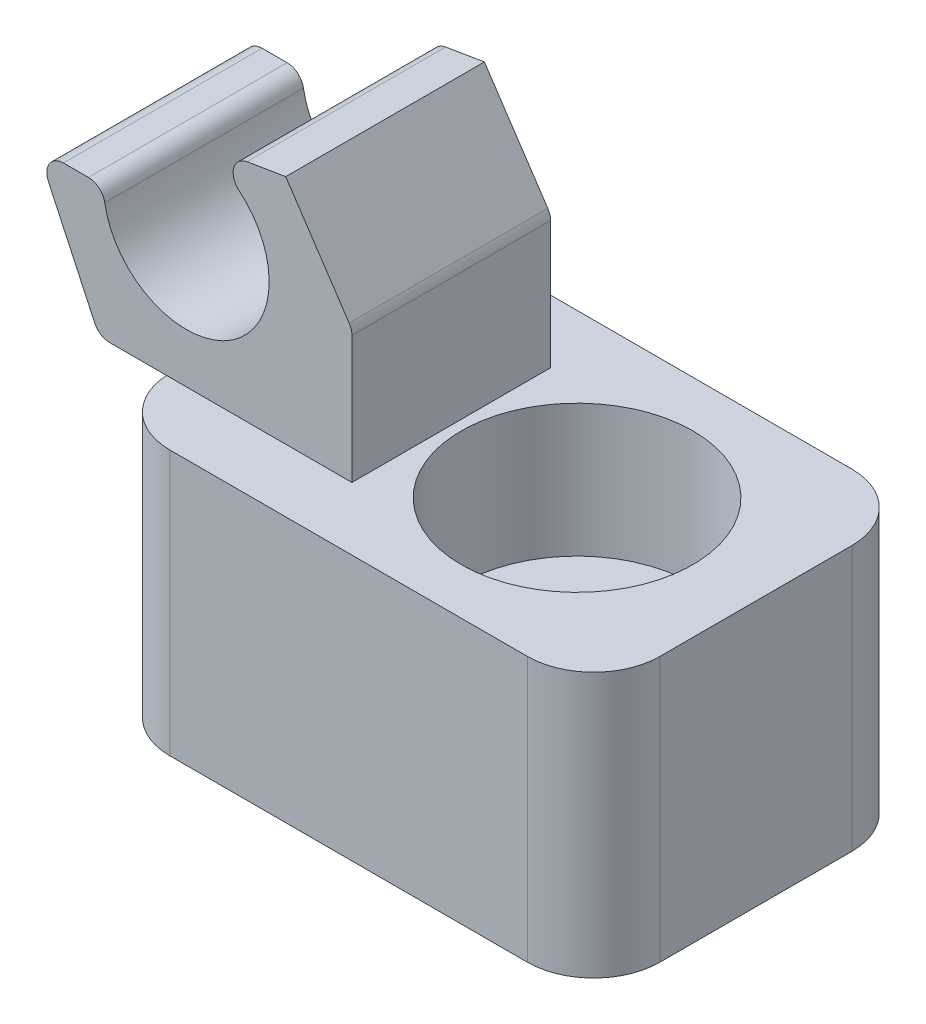
ISO-10303-21;
HEADER;
FILE_DESCRIPTION(('STEP AP214'),'2;1');
FILE_NAME('part.step','',(''),(''),'','','');
FILE_SCHEMA(('AUTOMOTIVE_DESIGN { 1 0 10303 214 1 1 1 1 }'));
ENDSEC;
DATA;
#1=APPLICATION_CONTEXT('core data for automotive mechanical design processes');
#2=APPLICATION_PROTOCOL_DEFINITION('international standard','automotive_design',2000,#1);
#3=PRODUCT_CONTEXT('',#1,'mechanical');
#4=PRODUCT('Part','Part','',(#3));
#5=PRODUCT_RELATED_PRODUCT_CATEGORY('part','',(#4));
#6=PRODUCT_DEFINITION_FORMATION('','',#4);
#7=PRODUCT_DEFINITION_CONTEXT('part definition',#1,'design');
#8=PRODUCT_DEFINITION('design','',#6,#7);
#9=PRODUCT_DEFINITION_SHAPE('','',#8);
#10=(LENGTH_UNIT() NAMED_UNIT(*) SI_UNIT(.MILLI.,.METRE.));
#11=(NAMED_UNIT(*) PLANE_ANGLE_UNIT() SI_UNIT($,.RADIAN.));
#12=(NAMED_UNIT(*) SI_UNIT($,.STERADIAN.) SOLID_ANGLE_UNIT());
#13=UNCERTAINTY_MEASURE_WITH_UNIT(LENGTH_MEASURE(1.E-05),#10,'distance_accuracy_value','');
#14=(GEOMETRIC_REPRESENTATION_CONTEXT(3) GLOBAL_UNCERTAINTY_ASSIGNED_CONTEXT((#13)) GLOBAL_UNIT_ASSIGNED_CONTEXT((#10,
#11,#12)) REPRESENTATION_CONTEXT('',''));
#15=CARTESIAN_POINT('',(0.,0.,0.));
#16=DIRECTION('',(0.,0.,1.));
#17=DIRECTION('',(1.,0.,0.));
#18=AXIS2_PLACEMENT_3D('',#15,#16,#17);
#19=CARTESIAN_POINT('',(5.4,8.,-2.9));
#20=DIRECTION('',(0.,-1.,0.));
#21=DIRECTION('',(0.,0.,-1.));
#22=AXIS2_PLACEMENT_3D('',#19,#20,#21);
#23=CYLINDRICAL_SURFACE('',#22,2.);
#24=CARTESIAN_POINT('',(5.4,0.,-2.9));
#25=DIRECTION('',(0.,1.,0.));
#26=DIRECTION('',(0.,0.,-1.));
#27=AXIS2_PLACEMENT_3D('',#24,#25,#26);
#28=CIRCLE('',#27,2.);
#29=CARTESIAN_POINT('',(7.4,0.,-2.89999999999999));
#30=VERTEX_POINT('',#29);
#31=CARTESIAN_POINT('',(5.39999999999999,0.,-4.9));
#32=VERTEX_POINT('',#31);
#33=EDGE_CURVE('E235',#30,#32,#28,.T.);
#34=ORIENTED_EDGE('',*,*,#33,.T.);
#35=DIRECTION('',(0.,-1.,0.));
#36=VECTOR('',#35,1.);
#37=CARTESIAN_POINT('',(5.39999999999999,8.,-4.9));
#38=LINE('',#37,#36);
#39=CARTESIAN_POINT('',(5.39999999999999,8.,-4.9));
#40=VERTEX_POINT('',#39);
#41=EDGE_CURVE('E296',#40,#32,#38,.T.);
#42=ORIENTED_EDGE('',*,*,#41,.F.);
#43=CARTESIAN_POINT('',(5.4,8.,-2.9));
#44=DIRECTION('',(0.,1.,0.));
#45=DIRECTION('',(0.,0.,-1.));
#46=AXIS2_PLACEMENT_3D('',#43,#44,#45);
#47=CIRCLE('',#46,2.);
#48=CARTESIAN_POINT('',(7.4,8.,-2.89999999999999));
#49=VERTEX_POINT('',#48);
#50=EDGE_CURVE('E238',#49,#40,#47,.T.);
#51=ORIENTED_EDGE('',*,*,#50,.F.);
#52=DIRECTION('',(0.,-1.,0.));
#53=VECTOR('',#52,1.);
#54=CARTESIAN_POINT('',(7.4,8.,-2.89999999999999));
#55=LINE('',#54,#53);
#56=EDGE_CURVE('E260',#49,#30,#55,.T.);
#57=ORIENTED_EDGE('',*,*,#56,.T.);
#58=EDGE_LOOP('',(#34,#42,#51,#57));
#59=FACE_BOUND('',#58,.T.);
#60=ADVANCED_FACE('F35',(#59),#23,.T.);
#61=CARTESIAN_POINT('',(-5.39999999999998,8.,-4.9));
#62=DIRECTION('',(0.,0.,1.));
#63=DIRECTION('',(1.,0.,0.));
#64=AXIS2_PLACEMENT_3D('',#61,#62,#63);
#65=PLANE('',#64);
#66=DIRECTION('',(-1.,0.,0.));
#67=VECTOR('',#66,1.);
#68=CARTESIAN_POINT('',(-5.39999999999998,0.,-4.9));
#69=LINE('',#68,#67);
#70=CARTESIAN_POINT('',(-5.39999999999998,0.,-4.9));
#71=VERTEX_POINT('',#70);
#72=EDGE_CURVE('E263',#32,#71,#69,.T.);
#73=ORIENTED_EDGE('',*,*,#72,.T.);
#74=DIRECTION('',(0.,-1.,0.));
#75=VECTOR('',#74,1.);
#76=CARTESIAN_POINT('',(-5.39999999999998,8.,-4.9));
#77=LINE('',#76,#75);
#78=CARTESIAN_POINT('',(-5.39999999999998,8.,-4.9));
#79=VERTEX_POINT('',#78);
#80=EDGE_CURVE('E293',#79,#71,#77,.T.);
#81=ORIENTED_EDGE('',*,*,#80,.F.);
#82=DIRECTION('',(-1.,0.,0.));
#83=VECTOR('',#82,1.);
#84=CARTESIAN_POINT('',(-5.39999999999998,8.,-4.9));
#85=LINE('',#84,#83);
#86=EDGE_CURVE('E241',#40,#79,#85,.T.);
#87=ORIENTED_EDGE('',*,*,#86,.F.);
#88=ORIENTED_EDGE('',*,*,#41,.T.);
#89=EDGE_LOOP('',(#73,#81,#87,#88));
#90=FACE_BOUND('',#89,.T.);
#91=ADVANCED_FACE('F379',(#90),#65,.F.);
#92=CARTESIAN_POINT('',(-5.4,8.,-2.9));
#93=DIRECTION('',(0.,-1.,0.));
#94=DIRECTION('',(0.,0.,-1.));
#95=AXIS2_PLACEMENT_3D('',#92,#93,#94);
#96=CYLINDRICAL_SURFACE('',#95,2.);
#97=CARTESIAN_POINT('',(-5.4,0.,-2.9));
#98=DIRECTION('',(0.,1.,0.));
#99=DIRECTION('',(0.,0.,-1.));
#100=AXIS2_PLACEMENT_3D('',#97,#98,#99);
#101=CIRCLE('',#100,2.);
#102=CARTESIAN_POINT('',(-7.4,0.,-2.89999999999999));
#103=VERTEX_POINT('',#102);
#104=EDGE_CURVE('E265',#71,#103,#101,.T.);
#105=ORIENTED_EDGE('',*,*,#104,.T.);
#106=DIRECTION('',(0.,-1.,0.));
#107=VECTOR('',#106,1.);
#108=CARTESIAN_POINT('',(-7.4,8.,-2.89999999999999));
#109=LINE('',#108,#107);
#110=CARTESIAN_POINT('',(-7.4,8.,-2.89999999999999));
#111=VERTEX_POINT('',#110);
#112=EDGE_CURVE('E290',#111,#103,#109,.T.);
#113=ORIENTED_EDGE('',*,*,#112,.F.);
#114=CARTESIAN_POINT('',(-5.4,8.,-2.9));
#115=DIRECTION('',(0.,1.,0.));
#116=DIRECTION('',(0.,0.,-1.));
#117=AXIS2_PLACEMENT_3D('',#114,#115,#116);
#118=CIRCLE('',#117,2.);
#119=CARTESIAN_POINT('',(-7.39749843554382,8.,-3.));
#120=VERTEX_POINT('',#119);
#121=EDGE_CURVE('E244',#120,#111,#118,.T.);
#122=ORIENTED_EDGE('',*,*,#121,.F.);
#123=EDGE_CURVE('E245',#79,#120,#118,.T.);
#124=ORIENTED_EDGE('',*,*,#123,.F.);
#125=ORIENTED_EDGE('',*,*,#80,.T.);
#126=EDGE_LOOP('',(#105,#113,#122,#124,#125));
#127=FACE_BOUND('',#126,.T.);
#128=ADVANCED_FACE('F385',(#127),#96,.T.);
#129=CARTESIAN_POINT('',(-7.4,8.,2.89999999999999));
#130=DIRECTION('',(1.,0.,0.));
#131=DIRECTION('',(0.,0.,-1.));
#132=AXIS2_PLACEMENT_3D('',#129,#130,#131);
#133=PLANE('',#132);
#134=DIRECTION('',(0.,0.,1.));
#135=VECTOR('',#134,1.);
#136=CARTESIAN_POINT('',(-7.4,0.,2.89999999999999));
#137=LINE('',#136,#135);
#138=CARTESIAN_POINT('',(-7.4,0.,2.89999999999999));
#139=VERTEX_POINT('',#138);
#140=EDGE_CURVE('E267',#103,#139,#137,.T.);
#141=ORIENTED_EDGE('',*,*,#140,.T.);
#142=DIRECTION('',(0.,-1.,0.));
#143=VECTOR('',#142,1.);
#144=CARTESIAN_POINT('',(-7.4,8.,2.89999999999999));
#145=LINE('',#144,#143);
#146=CARTESIAN_POINT('',(-7.4,8.,2.89999999999999));
#147=VERTEX_POINT('',#146);
#148=EDGE_CURVE('E287',#147,#139,#145,.T.);
#149=ORIENTED_EDGE('',*,*,#148,.F.);
#150=DIRECTION('',(0.,0.,1.));
#151=VECTOR('',#150,1.);
#152=CARTESIAN_POINT('',(-7.4,8.,2.89999999999999));
#153=LINE('',#152,#151);
#154=EDGE_CURVE('E247',#111,#147,#153,.T.);
#155=ORIENTED_EDGE('',*,*,#154,.F.);
#156=ORIENTED_EDGE('',*,*,#112,.T.);
#157=EDGE_LOOP('',(#141,#149,#155,#156));
#158=FACE_BOUND('',#157,.T.);
#159=ADVANCED_FACE('F429',(#158),#133,.F.);
#160=CARTESIAN_POINT('',(-5.4,8.,2.9));
#161=DIRECTION('',(0.,-1.,0.));
#162=DIRECTION('',(0.,0.,-1.));
#163=AXIS2_PLACEMENT_3D('',#160,#161,#162);
#164=CYLINDRICAL_SURFACE('',#163,2.);
#165=CARTESIAN_POINT('',(-5.4,0.,2.9));
#166=DIRECTION('',(0.,1.,0.));
#167=DIRECTION('',(0.,0.,-1.));
#168=AXIS2_PLACEMENT_3D('',#165,#166,#167);
#169=CIRCLE('',#168,2.);
#170=CARTESIAN_POINT('',(-5.39999999999998,0.,4.9));
#171=VERTEX_POINT('',#170);
#172=EDGE_CURVE('E269',#139,#171,#169,.T.);
#173=ORIENTED_EDGE('',*,*,#172,.T.);
#174=DIRECTION('',(0.,-1.,0.));
#175=VECTOR('',#174,1.);
#176=CARTESIAN_POINT('',(-5.39999999999998,8.,4.9));
#177=LINE('',#176,#175);
#178=CARTESIAN_POINT('',(-5.39999999999998,8.,4.9));
#179=VERTEX_POINT('',#178);
#180=EDGE_CURVE('E284',#179,#171,#177,.T.);
#181=ORIENTED_EDGE('',*,*,#180,.F.);
#182=CARTESIAN_POINT('',(-5.4,8.,2.9));
#183=DIRECTION('',(0.,1.,0.));
#184=DIRECTION('',(0.,0.,-1.));
#185=AXIS2_PLACEMENT_3D('',#182,#183,#184);
#186=CIRCLE('',#185,2.);
#187=CARTESIAN_POINT('',(-7.39749843554382,8.,3.));
#188=VERTEX_POINT('',#187);
#189=EDGE_CURVE('E250',#188,#179,#186,.T.);
#190=ORIENTED_EDGE('',*,*,#189,.F.);
#191=EDGE_CURVE('E251',#147,#188,#186,.T.);
#192=ORIENTED_EDGE('',*,*,#191,.F.);
#193=ORIENTED_EDGE('',*,*,#148,.T.);
#194=EDGE_LOOP('',(#173,#181,#190,#192,#193));
#195=FACE_BOUND('',#194,.T.);
#196=ADVANCED_FACE('F416',(#195),#164,.T.);
#197=CARTESIAN_POINT('',(-5.39999999999998,8.,4.9));
#198=DIRECTION('',(0.,0.,-1.));
#199=DIRECTION('',(-1.,0.,0.));
#200=AXIS2_PLACEMENT_3D('',#197,#198,#199);
#201=PLANE('',#200);
#202=DIRECTION('',(1.,0.,0.));
#203=VECTOR('',#202,1.);
#204=CARTESIAN_POINT('',(-5.39999999999998,0.,4.9));
#205=LINE('',#204,#203);
#206=CARTESIAN_POINT('',(5.39999999999999,0.,4.9));
#207=VERTEX_POINT('',#206);
#208=EDGE_CURVE('E271',#171,#207,#205,.T.);
#209=ORIENTED_EDGE('',*,*,#208,.T.);
#210=DIRECTION('',(0.,-1.,0.));
#211=VECTOR('',#210,1.);
#212=CARTESIAN_POINT('',(5.39999999999999,8.,4.9));
#213=LINE('',#212,#211);
#214=CARTESIAN_POINT('',(5.39999999999999,8.,4.9));
#215=VERTEX_POINT('',#214);
#216=EDGE_CURVE('E281',#215,#207,#213,.T.);
#217=ORIENTED_EDGE('',*,*,#216,.F.);
#218=DIRECTION('',(1.,0.,0.));
#219=VECTOR('',#218,1.);
#220=CARTESIAN_POINT('',(-5.39999999999998,8.,4.9));
#221=LINE('',#220,#219);
#222=EDGE_CURVE('E254',#179,#215,#221,.T.);
#223=ORIENTED_EDGE('',*,*,#222,.F.);
#224=ORIENTED_EDGE('',*,*,#180,.T.);
#225=EDGE_LOOP('',(#209,#217,#223,#224));
#226=FACE_BOUND('',#225,.T.);
#227=ADVANCED_FACE('F436',(#226),#201,.F.);
#228=CARTESIAN_POINT('',(5.4,8.,2.9));
#229=DIRECTION('',(0.,-1.,0.));
#230=DIRECTION('',(0.,0.,-1.));
#231=AXIS2_PLACEMENT_3D('',#228,#229,#230);
#232=CYLINDRICAL_SURFACE('',#231,2.);
#233=CARTESIAN_POINT('',(5.4,0.,2.9));
#234=DIRECTION('',(0.,1.,0.));
#235=DIRECTION('',(0.,0.,1.));
#236=AXIS2_PLACEMENT_3D('',#233,#234,#235);
#237=CIRCLE('',#236,2.);
#238=CARTESIAN_POINT('',(7.4,0.,2.89999999999999));
#239=VERTEX_POINT('',#238);
#240=EDGE_CURVE('E273',#207,#239,#237,.T.);
#241=ORIENTED_EDGE('',*,*,#240,.T.);
#242=DIRECTION('',(0.,-1.,0.));
#243=VECTOR('',#242,1.);
#244=CARTESIAN_POINT('',(7.4,8.,2.89999999999999));
#245=LINE('',#244,#243);
#246=CARTESIAN_POINT('',(7.4,8.,2.89999999999999));
#247=VERTEX_POINT('',#246);
#248=EDGE_CURVE('E278',#247,#239,#245,.T.);
#249=ORIENTED_EDGE('',*,*,#248,.F.);
#250=CARTESIAN_POINT('',(5.4,8.,2.9));
#251=DIRECTION('',(0.,1.,0.));
#252=DIRECTION('',(0.,0.,1.));
#253=AXIS2_PLACEMENT_3D('',#250,#251,#252);
#254=CIRCLE('',#253,2.);
#255=EDGE_CURVE('E256',#215,#247,#254,.T.);
#256=ORIENTED_EDGE('',*,*,#255,.F.);
#257=ORIENTED_EDGE('',*,*,#216,.T.);
#258=EDGE_LOOP('',(#241,#249,#256,#257));
#259=FACE_BOUND('',#258,.T.);
#260=ADVANCED_FACE('F440',(#259),#232,.T.);
#261=CARTESIAN_POINT('',(7.4,8.,2.89999999999999));
#262=DIRECTION('',(-1.,0.,0.));
#263=DIRECTION('',(0.,0.,1.));
#264=AXIS2_PLACEMENT_3D('',#261,#262,#263);
#265=PLANE('',#264);
#266=DIRECTION('',(0.,0.,-1.));
#267=VECTOR('',#266,1.);
#268=CARTESIAN_POINT('',(7.4,0.,2.89999999999999));
#269=LINE('',#268,#267);
#270=EDGE_CURVE('E242',#239,#30,#269,.T.);
#271=ORIENTED_EDGE('',*,*,#270,.T.);
#272=ORIENTED_EDGE('',*,*,#56,.F.);
#273=DIRECTION('',(0.,0.,-1.));
#274=VECTOR('',#273,1.);
#275=CARTESIAN_POINT('',(7.4,8.,2.89999999999999));
#276=LINE('',#275,#274);
#277=EDGE_CURVE('E258',#247,#49,#276,.T.);
#278=ORIENTED_EDGE('',*,*,#277,.F.);
#279=ORIENTED_EDGE('',*,*,#248,.T.);
#280=EDGE_LOOP('',(#271,#272,#278,#279));
#281=FACE_BOUND('',#280,.T.);
#282=ADVANCED_FACE('F446',(#281),#265,.F.);
#283=CARTESIAN_POINT('',(5.4,8.,-2.9));
#284=DIRECTION('',(0.,-1.,0.));
#285=DIRECTION('',(0.,0.,-1.));
#286=AXIS2_PLACEMENT_3D('',#283,#284,#285);
#287=PLANE('',#286);
#288=CARTESIAN_POINT('',(2.,8.,0.));
#289=DIRECTION('',(0.,1.,0.));
#290=DIRECTION('',(0.,0.,1.));
#291=AXIS2_PLACEMENT_3D('',#288,#289,#290);
#292=CIRCLE('',#291,3.5);
#293=CARTESIAN_POINT('',(2.,8.,3.5));
#294=VERTEX_POINT('',#293);
#295=EDGE_CURVE('E229',#294,#294,#292,.T.);
#296=ORIENTED_EDGE('',*,*,#295,.F.);
#297=EDGE_LOOP('',(#296));
#298=FACE_BOUND('',#297,.T.);
#299=DIRECTION('',(0.,0.,1.));
#300=VECTOR('',#299,1.);
#301=CARTESIAN_POINT('',(-1.8,8.,-3.));
#302=LINE('',#301,#300);
#303=CARTESIAN_POINT('',(-1.8,8.,-3.));
#304=VERTEX_POINT('',#303);
#305=CARTESIAN_POINT('',(-1.8,8.,3.));
#306=VERTEX_POINT('',#305);
#307=EDGE_CURVE('E201',#304,#306,#302,.T.);
#308=ORIENTED_EDGE('',*,*,#307,.T.);
#309=DIRECTION('',(-1.,0.,0.));
#310=VECTOR('',#309,1.);
#311=CARTESIAN_POINT('',(0.,8.,3.));
#312=LINE('',#311,#310);
#313=EDGE_CURVE('E354',#306,#188,#312,.T.);
#314=ORIENTED_EDGE('',*,*,#313,.T.);
#315=ORIENTED_EDGE('',*,*,#189,.T.);
#316=ORIENTED_EDGE('',*,*,#222,.T.);
#317=ORIENTED_EDGE('',*,*,#255,.T.);
#318=ORIENTED_EDGE('',*,*,#277,.T.);
#319=ORIENTED_EDGE('',*,*,#50,.T.);
#320=ORIENTED_EDGE('',*,*,#86,.T.);
#321=ORIENTED_EDGE('',*,*,#123,.T.);
#322=DIRECTION('',(-1.,0.,0.));
#323=VECTOR('',#322,1.);
#324=CARTESIAN_POINT('',(0.,8.,-3.));
#325=LINE('',#324,#323);
#326=EDGE_CURVE('E216',#304,#120,#325,.T.);
#327=ORIENTED_EDGE('',*,*,#326,.F.);
#328=EDGE_LOOP('',(#308,#314,#315,#316,#317,#318,#319,#320,#321,#327));
#329=FACE_BOUND('',#328,.T.);
#330=ADVANCED_FACE('F421',(#298,#329),#287,.F.);
#331=CARTESIAN_POINT('',(5.4,0.,-2.9));
#332=DIRECTION('',(0.,-1.,0.));
#333=DIRECTION('',(0.,0.,-1.));
#334=AXIS2_PLACEMENT_3D('',#331,#332,#333);
#335=PLANE('',#334);
#336=CARTESIAN_POINT('',(2.,0.,0.));
#337=DIRECTION('',(0.,1.,0.));
#338=DIRECTION('',(0.,0.,1.));
#339=AXIS2_PLACEMENT_3D('',#336,#337,#338);
#340=CIRCLE('',#339,1.8);
#341=CARTESIAN_POINT('',(2.,0.,1.8));
#342=VERTEX_POINT('',#341);
#343=EDGE_CURVE('E226',#342,#342,#340,.T.);
#344=ORIENTED_EDGE('',*,*,#343,.T.);
#345=EDGE_LOOP('',(#344));
#346=FACE_BOUND('',#345,.T.);
#347=ORIENTED_EDGE('',*,*,#33,.F.);
#348=ORIENTED_EDGE('',*,*,#270,.F.);
#349=ORIENTED_EDGE('',*,*,#240,.F.);
#350=ORIENTED_EDGE('',*,*,#208,.F.);
#351=ORIENTED_EDGE('',*,*,#172,.F.);
#352=ORIENTED_EDGE('',*,*,#140,.F.);
#353=ORIENTED_EDGE('',*,*,#104,.F.);
#354=ORIENTED_EDGE('',*,*,#72,.F.);
#355=EDGE_LOOP('',(#347,#348,#349,#350,#351,#352,#353,#354));
#356=FACE_BOUND('',#355,.T.);
#357=ADVANCED_FACE('F432',(#346,#356),#335,.T.);
#358=CARTESIAN_POINT('',(2.,4.,0.));
#359=DIRECTION('',(0.,1.,0.));
#360=DIRECTION('',(0.,0.,1.));
#361=AXIS2_PLACEMENT_3D('',#358,#359,#360);
#362=CYLINDRICAL_SURFACE('',#361,3.5);
#363=CARTESIAN_POINT('',(2.,4.,0.));
#364=DIRECTION('',(0.,1.,0.));
#365=DIRECTION('',(0.,0.,1.));
#366=AXIS2_PLACEMENT_3D('',#363,#364,#365);
#367=CIRCLE('',#366,3.5);
#368=CARTESIAN_POINT('',(2.,4.,3.5));
#369=VERTEX_POINT('',#368);
#370=EDGE_CURVE('E232',#369,#369,#367,.T.);
#371=ORIENTED_EDGE('',*,*,#370,.F.);
#372=EDGE_LOOP('',(#371));
#373=FACE_BOUND('',#372,.T.);
#374=ORIENTED_EDGE('',*,*,#295,.T.);
#375=EDGE_LOOP('',(#374));
#376=FACE_BOUND('',#375,.T.);
#377=ADVANCED_FACE('F594',(#373,#376),#362,.F.);
#378=CARTESIAN_POINT('',(2.,4.,0.));
#379=DIRECTION('',(0.,1.,0.));
#380=DIRECTION('',(0.,0.,1.));
#381=AXIS2_PLACEMENT_3D('',#378,#379,#380);
#382=PLANE('',#381);
#383=CARTESIAN_POINT('',(2.,4.,0.));
#384=DIRECTION('',(0.,1.,0.));
#385=DIRECTION('',(0.,0.,1.));
#386=AXIS2_PLACEMENT_3D('',#383,#384,#385);
#387=CIRCLE('',#386,1.8);
#388=CARTESIAN_POINT('',(2.,4.,1.8));
#389=VERTEX_POINT('',#388);
#390=EDGE_CURVE('E200',#389,#389,#387,.T.);
#391=ORIENTED_EDGE('',*,*,#390,.F.);
#392=EDGE_LOOP('',(#391));
#393=FACE_BOUND('',#392,.T.);
#394=ORIENTED_EDGE('',*,*,#370,.T.);
#395=EDGE_LOOP('',(#394));
#396=FACE_BOUND('',#395,.T.);
#397=ADVANCED_FACE('F590',(#393,#396),#382,.T.);
#398=CARTESIAN_POINT('',(2.,0.,0.));
#399=DIRECTION('',(0.,1.,0.));
#400=DIRECTION('',(0.,0.,1.));
#401=AXIS2_PLACEMENT_3D('',#398,#399,#400);
#402=CYLINDRICAL_SURFACE('',#401,1.8);
#403=ORIENTED_EDGE('',*,*,#343,.F.);
#404=EDGE_LOOP('',(#403));
#405=FACE_BOUND('',#404,.T.);
#406=ORIENTED_EDGE('',*,*,#390,.T.);
#407=EDGE_LOOP('',(#406));
#408=FACE_BOUND('',#407,.T.);
#409=ADVANCED_FACE('F473',(#405,#408),#402,.F.);
#410=CARTESIAN_POINT('',(0.,8.,-3.));
#411=DIRECTION('',(0.,1.,0.));
#412=DIRECTION('',(0.,0.,1.));
#413=AXIS2_PLACEMENT_3D('',#410,#411,#412);
#414=PLANE('',#413);
#415=CARTESIAN_POINT('',(-9.11623423697627,8.,3.));
#416=VERTEX_POINT('',#415);
#417=EDGE_CURVE('E353',#188,#416,#312,.T.);
#418=ORIENTED_EDGE('',*,*,#417,.T.);
#419=DIRECTION('',(0.,0.,1.));
#420=VECTOR('',#419,1.);
#421=CARTESIAN_POINT('',(-9.11623423697627,8.,-3.));
#422=LINE('',#421,#420);
#423=CARTESIAN_POINT('',(-9.11623423697627,8.,-3.));
#424=VERTEX_POINT('',#423);
#425=EDGE_CURVE('E313',#416,#424,#422,.F.);
#426=ORIENTED_EDGE('',*,*,#425,.T.);
#427=EDGE_CURVE('E215',#120,#424,#325,.T.);
#428=ORIENTED_EDGE('',*,*,#427,.F.);
#429=ORIENTED_EDGE('',*,*,#121,.T.);
#430=ORIENTED_EDGE('',*,*,#154,.T.);
#431=ORIENTED_EDGE('',*,*,#191,.T.);
#432=EDGE_LOOP('',(#418,#426,#428,#429,#430,#431));
#433=FACE_BOUND('',#432,.T.);
#434=ADVANCED_FACE('F409',(#433),#414,.F.);
#435=CARTESIAN_POINT('',(-6.8,12.,-3.));
#436=DIRECTION('',(0.,0.,1.));
#437=DIRECTION('',(1.,0.,0.));
#438=AXIS2_PLACEMENT_3D('',#435,#436,#437);
#439=CYLINDRICAL_SURFACE('',#438,2.5);
#440=CARTESIAN_POINT('',(-6.8,12.,-3.));
#441=DIRECTION('',(0.,0.,1.));
#442=DIRECTION('',(1.,0.,0.));
#443=AXIS2_PLACEMENT_3D('',#440,#441,#442);
#444=CIRCLE('',#443,2.5);
#445=CARTESIAN_POINT('',(-9.26503324295817,11.5833333333333,-3.));
#446=VERTEX_POINT('',#445);
#447=CARTESIAN_POINT('',(-5.20667093944838,13.9264741121546,-3.));
#448=VERTEX_POINT('',#447);
#449=EDGE_CURVE('E205',#446,#448,#444,.T.);
#450=ORIENTED_EDGE('',*,*,#449,.F.);
#451=DIRECTION('',(0.,0.,1.));
#452=VECTOR('',#451,1.);
#453=CARTESIAN_POINT('',(-9.26503324295817,11.5833333333333,-3.));
#454=LINE('',#453,#452);
#455=CARTESIAN_POINT('',(-9.26503324295817,11.5833333333333,3.));
#456=VERTEX_POINT('',#455);
#457=EDGE_CURVE('E43',#446,#456,#454,.T.);
#458=ORIENTED_EDGE('',*,*,#457,.T.);
#459=CARTESIAN_POINT('',(-6.8,12.,3.));
#460=DIRECTION('',(0.,0.,1.));
#461=DIRECTION('',(1.,0.,0.));
#462=AXIS2_PLACEMENT_3D('',#459,#460,#461);
#463=CIRCLE('',#462,2.5);
#464=CARTESIAN_POINT('',(-5.20667093944838,13.9264741121546,3.));
#465=VERTEX_POINT('',#464);
#466=EDGE_CURVE('E341',#456,#465,#463,.T.);
#467=ORIENTED_EDGE('',*,*,#466,.T.);
#468=DIRECTION('',(0.,0.,1.));
#469=VECTOR('',#468,1.);
#470=CARTESIAN_POINT('',(-5.20667093944838,13.9264741121546,-3.));
#471=LINE('',#470,#469);
#472=EDGE_CURVE('E333',#465,#448,#471,.F.);
#473=ORIENTED_EDGE('',*,*,#472,.T.);
#474=EDGE_LOOP('',(#450,#458,#467,#473));
#475=FACE_BOUND('',#474,.T.);
#476=ADVANCED_FACE('F340',(#475),#439,.F.);
#477=CARTESIAN_POINT('',(-2.53513513513513,15.2108108108108,-3.));
#478=DIRECTION('',(-0.164398987305357,0.986393923832144,0.));
#479=DIRECTION('',(-0.986393923832144,-0.164398987305357,0.));
#480=AXIS2_PLACEMENT_3D('',#477,#478,#479);
#481=PLANE('',#480);
#482=DIRECTION('',(-0.986393923832144,-0.164398987305357,0.));
#483=VECTOR('',#482,1.);
#484=CARTESIAN_POINT('',(-2.53513513513513,15.2108108108108,-3.));
#485=LINE('',#484,#483);
#486=CARTESIAN_POINT('',(-3.8,15.,-3.));
#487=VERTEX_POINT('',#486);
#488=CARTESIAN_POINT('',(-4.97020462099074,14.8049658965015,-3.));
#489=VERTEX_POINT('',#488);
#490=EDGE_CURVE('E223',#487,#489,#485,.T.);
#491=ORIENTED_EDGE('',*,*,#490,.T.);
#492=DIRECTION('',(0.,0.,-1.));
#493=VECTOR('',#492,1.);
#494=CARTESIAN_POINT('',(-4.97020462099074,14.8049658965015,3.));
#495=LINE('',#494,#493);
#496=CARTESIAN_POINT('',(-4.97020462099074,14.8049658965015,3.));
#497=VERTEX_POINT('',#496);
#498=EDGE_CURVE('E11',#489,#497,#495,.F.);
#499=ORIENTED_EDGE('',*,*,#498,.T.);
#500=DIRECTION('',(-0.986393923832144,-0.164398987305357,0.));
#501=VECTOR('',#500,1.);
#502=CARTESIAN_POINT('',(-2.53513513513513,15.2108108108108,3.));
#503=LINE('',#502,#501);
#504=CARTESIAN_POINT('',(-3.8,15.,3.));
#505=VERTEX_POINT('',#504);
#506=EDGE_CURVE('E185',#505,#497,#503,.T.);
#507=ORIENTED_EDGE('',*,*,#506,.F.);
#508=DIRECTION('',(0.,0.,1.));
#509=VECTOR('',#508,1.);
#510=CARTESIAN_POINT('',(-3.8,15.,-3.));
#511=LINE('',#510,#509);
#512=EDGE_CURVE('E193',#487,#505,#511,.T.);
#513=ORIENTED_EDGE('',*,*,#512,.F.);
#514=EDGE_LOOP('',(#491,#499,#507,#513));
#515=FACE_BOUND('',#514,.T.);
#516=ADVANCED_FACE('F203',(#515),#481,.T.);
#517=CARTESIAN_POINT('',(4.29230769230769,2.86153846153846,-3.));
#518=DIRECTION('',(0.832050294337844,0.554700196225229,0.));
#519=DIRECTION('',(-0.554700196225229,0.832050294337843,0.));
#520=AXIS2_PLACEMENT_3D('',#517,#518,#519);
#521=PLANE('',#520);
#522=DIRECTION('',(-0.554700196225229,0.832050294337844,0.));
#523=VECTOR('',#522,1.);
#524=CARTESIAN_POINT('',(4.29230769230769,2.86153846153846,3.));
#525=LINE('',#524,#523);
#526=CARTESIAN_POINT('',(-1.88397485283108,12.1259622792466,3.));
#527=VERTEX_POINT('',#526);
#528=EDGE_CURVE('E180',#527,#505,#525,.T.);
#529=ORIENTED_EDGE('',*,*,#528,.F.);
#530=DIRECTION('',(0.,0.,1.));
#531=VECTOR('',#530,1.);
#532=CARTESIAN_POINT('',(-1.88397485283108,12.1259622792466,-3.));
#533=LINE('',#532,#531);
#534=CARTESIAN_POINT('',(-1.88397485283108,12.1259622792466,-3.));
#535=VERTEX_POINT('',#534);
#536=EDGE_CURVE('E331',#527,#535,#533,.F.);
#537=ORIENTED_EDGE('',*,*,#536,.T.);
#538=DIRECTION('',(-0.554700196225229,0.832050294337844,0.));
#539=VECTOR('',#538,1.);
#540=CARTESIAN_POINT('',(4.29230769230769,2.86153846153846,-3.));
#541=LINE('',#540,#539);
#542=EDGE_CURVE('E196',#535,#487,#541,.T.);
#543=ORIENTED_EDGE('',*,*,#542,.T.);
#544=ORIENTED_EDGE('',*,*,#512,.T.);
#545=EDGE_LOOP('',(#529,#537,#543,#544));
#546=FACE_BOUND('',#545,.T.);
#547=ADVANCED_FACE('F194',(#546),#521,.T.);
#548=CARTESIAN_POINT('',(-1.8,0.,-3.));
#549=DIRECTION('',(1.,0.,0.));
#550=DIRECTION('',(0.,0.,-1.));
#551=AXIS2_PLACEMENT_3D('',#548,#549,#550);
#552=PLANE('',#551);
#553=DIRECTION('',(0.,1.,0.));
#554=VECTOR('',#553,1.);
#555=CARTESIAN_POINT('',(-1.8,0.,-3.));
#556=LINE('',#555,#554);
#557=CARTESIAN_POINT('',(-1.8,11.848612181134,-3.));
#558=VERTEX_POINT('',#557);
#559=EDGE_CURVE('E219',#304,#558,#556,.T.);
#560=ORIENTED_EDGE('',*,*,#559,.T.);
#561=DIRECTION('',(0.,0.,1.));
#562=VECTOR('',#561,1.);
#563=CARTESIAN_POINT('',(-1.8,11.848612181134,-3.));
#564=LINE('',#563,#562);
#565=CARTESIAN_POINT('',(-1.8,11.848612181134,3.));
#566=VERTEX_POINT('',#565);
#567=EDGE_CURVE('E328',#558,#566,#564,.T.);
#568=ORIENTED_EDGE('',*,*,#567,.T.);
#569=DIRECTION('',(0.,1.,0.));
#570=VECTOR('',#569,1.);
#571=CARTESIAN_POINT('',(-1.8,0.,3.));
#572=LINE('',#571,#570);
#573=EDGE_CURVE('E190',#306,#566,#572,.T.);
#574=ORIENTED_EDGE('',*,*,#573,.F.);
#575=ORIENTED_EDGE('',*,*,#307,.F.);
#576=EDGE_LOOP('',(#560,#568,#574,#575));
#577=FACE_BOUND('',#576,.T.);
#578=ADVANCED_FACE('F360',(#577),#552,.T.);
#579=CARTESIAN_POINT('',(-4.68548333601512,-2.18487676174147,-3.));
#580=DIRECTION('',(0.906307787036651,0.422618261740697,0.));
#581=DIRECTION('',(-0.422618261740697,0.906307787036651,0.));
#582=AXIS2_PLACEMENT_3D('',#579,#580,#581);
#583=PLANE('',#582);
#584=DIRECTION('',(-0.422618261740697,0.906307787036651,0.));
#585=VECTOR('',#584,1.);
#586=CARTESIAN_POINT('',(-4.68548333601512,-2.18487676174147,-3.));
#587=LINE('',#586,#585);
#588=CARTESIAN_POINT('',(-9.5693881304946,8.28869086912965,-3.));
#589=VERTEX_POINT('',#588);
#590=CARTESIAN_POINT('',(-10.9683111049596,11.2886908691297,-3.));
#591=VERTEX_POINT('',#590);
#592=EDGE_CURVE('E213',#589,#591,#587,.T.);
#593=ORIENTED_EDGE('',*,*,#592,.F.);
#594=DIRECTION('',(0.,0.,1.));
#595=VECTOR('',#594,1.);
#596=CARTESIAN_POINT('',(-9.5693881304946,8.28869086912965,-3.));
#597=LINE('',#596,#595);
#598=CARTESIAN_POINT('',(-9.5693881304946,8.28869086912965,3.));
#599=VERTEX_POINT('',#598);
#600=EDGE_CURVE('E301',#589,#599,#597,.T.);
#601=ORIENTED_EDGE('',*,*,#600,.T.);
#602=DIRECTION('',(-0.422618261740697,0.906307787036651,0.));
#603=VECTOR('',#602,1.);
#604=CARTESIAN_POINT('',(-4.68548333601512,-2.18487676174147,3.));
#605=LINE('',#604,#603);
#606=CARTESIAN_POINT('',(-10.9683111049596,11.2886908691297,3.));
#607=VERTEX_POINT('',#606);
#608=EDGE_CURVE('E348',#599,#607,#605,.T.);
#609=ORIENTED_EDGE('',*,*,#608,.T.);
#610=DIRECTION('',(0.,0.,1.));
#611=VECTOR('',#610,1.);
#612=CARTESIAN_POINT('',(-10.9683111049596,11.2886908691297,-3.));
#613=LINE('',#612,#611);
#614=EDGE_CURVE('E299',#607,#591,#613,.F.);
#615=ORIENTED_EDGE('',*,*,#614,.T.);
#616=EDGE_LOOP('',(#593,#601,#609,#615));
#617=FACE_BOUND('',#616,.T.);
#618=ADVANCED_FACE('F403',(#617),#583,.F.);
#619=CARTESIAN_POINT('',(0.,12.,-3.));
#620=DIRECTION('',(0.,-1.,0.));
#621=DIRECTION('',(0.,0.,-1.));
#622=AXIS2_PLACEMENT_3D('',#619,#620,#621);
#623=PLANE('',#622);
#624=DIRECTION('',(1.,0.,0.));
#625=VECTOR('',#624,1.);
#626=CARTESIAN_POINT('',(0.,12.,-3.));
#627=LINE('',#626,#625);
#628=CARTESIAN_POINT('',(-10.5151572114413,12.,-3.));
#629=VERTEX_POINT('',#628);
#630=CARTESIAN_POINT('',(-9.75803989154981,12.,-3.));
#631=VERTEX_POINT('',#630);
#632=EDGE_CURVE('E208',#629,#631,#627,.T.);
#633=ORIENTED_EDGE('',*,*,#632,.F.);
#634=DIRECTION('',(0.,0.,1.));
#635=VECTOR('',#634,1.);
#636=CARTESIAN_POINT('',(-10.5151572114413,12.,-3.));
#637=LINE('',#636,#635);
#638=CARTESIAN_POINT('',(-10.5151572114413,12.,3.));
#639=VERTEX_POINT('',#638);
#640=EDGE_CURVE('E325',#629,#639,#637,.T.);
#641=ORIENTED_EDGE('',*,*,#640,.T.);
#642=DIRECTION('',(1.,0.,0.));
#643=VECTOR('',#642,1.);
#644=CARTESIAN_POINT('',(0.,12.,3.));
#645=LINE('',#644,#643);
#646=CARTESIAN_POINT('',(-9.75803989154981,12.,3.));
#647=VERTEX_POINT('',#646);
#648=EDGE_CURVE('E346',#639,#647,#645,.T.);
#649=ORIENTED_EDGE('',*,*,#648,.T.);
#650=DIRECTION('',(0.,0.,1.));
#651=VECTOR('',#650,1.);
#652=CARTESIAN_POINT('',(-9.75803989154981,12.,-3.));
#653=LINE('',#652,#651);
#654=EDGE_CURVE('E50',#647,#631,#653,.F.);
#655=ORIENTED_EDGE('',*,*,#654,.T.);
#656=EDGE_LOOP('',(#633,#641,#649,#655));
#657=FACE_BOUND('',#656,.T.);
#658=ADVANCED_FACE('F400',(#657),#623,.F.);
#659=CARTESIAN_POINT('',(0.,0.,-3.));
#660=DIRECTION('',(0.,0.,1.));
#661=DIRECTION('',(1.,0.,0.));
#662=AXIS2_PLACEMENT_3D('',#659,#660,#661);
#663=PLANE('',#662);
#664=ORIENTED_EDGE('',*,*,#427,.T.);
#665=CARTESIAN_POINT('',(-9.11623423697627,8.5,-3.));
#666=DIRECTION('',(0.,0.,1.));
#667=DIRECTION('',(1.,0.,0.));
#668=AXIS2_PLACEMENT_3D('',#665,#666,#667);
#669=CIRCLE('',#668,0.5);
#670=EDGE_CURVE('E322',#424,#589,#669,.F.);
#671=ORIENTED_EDGE('',*,*,#670,.T.);
#672=ORIENTED_EDGE('',*,*,#592,.T.);
#673=CARTESIAN_POINT('',(-10.5151572114413,11.5,-3.));
#674=DIRECTION('',(0.,0.,1.));
#675=DIRECTION('',(1.,0.,0.));
#676=AXIS2_PLACEMENT_3D('',#673,#674,#675);
#677=CIRCLE('',#676,0.5);
#678=EDGE_CURVE('E57',#591,#629,#677,.F.);
#679=ORIENTED_EDGE('',*,*,#678,.T.);
#680=ORIENTED_EDGE('',*,*,#632,.T.);
#681=CARTESIAN_POINT('',(-9.75803989154981,11.5,-3.));
#682=DIRECTION('',(0.,0.,1.));
#683=DIRECTION('',(1.,0.,0.));
#684=AXIS2_PLACEMENT_3D('',#681,#682,#683);
#685=CIRCLE('',#684,0.5);
#686=EDGE_CURVE('E317',#631,#446,#685,.F.);
#687=ORIENTED_EDGE('',*,*,#686,.T.);
#688=ORIENTED_EDGE('',*,*,#449,.T.);
#689=CARTESIAN_POINT('',(-4.88800512733806,14.3117689345855,-3.));
#690=DIRECTION('',(0.,0.,1.));
#691=DIRECTION('',(1.,0.,0.));
#692=AXIS2_PLACEMENT_3D('',#689,#690,#691);
#693=CIRCLE('',#692,0.5);
#694=EDGE_CURVE('E315',#448,#489,#693,.F.);
#695=ORIENTED_EDGE('',*,*,#694,.T.);
#696=ORIENTED_EDGE('',*,*,#490,.F.);
#697=ORIENTED_EDGE('',*,*,#542,.F.);
#698=CARTESIAN_POINT('',(-2.3,11.848612181134,-3.));
#699=DIRECTION('',(0.,0.,1.));
#700=DIRECTION('',(1.,0.,0.));
#701=AXIS2_PLACEMENT_3D('',#698,#699,#700);
#702=CIRCLE('',#701,0.5);
#703=EDGE_CURVE('E319',#535,#558,#702,.F.);
#704=ORIENTED_EDGE('',*,*,#703,.T.);
#705=ORIENTED_EDGE('',*,*,#559,.F.);
#706=ORIENTED_EDGE('',*,*,#326,.T.);
#707=EDGE_LOOP('',(#664,#671,#672,#679,#680,#687,#688,#695,#696,#697,#704,#705,#706));
#708=FACE_BOUND('',#707,.T.);
#709=ADVANCED_FACE('F367',(#708),#663,.F.);
#710=CARTESIAN_POINT('',(0.,0.,3.));
#711=DIRECTION('',(0.,0.,1.));
#712=DIRECTION('',(1.,0.,0.));
#713=AXIS2_PLACEMENT_3D('',#710,#711,#712);
#714=PLANE('',#713);
#715=ORIENTED_EDGE('',*,*,#608,.F.);
#716=CARTESIAN_POINT('',(-9.11623423697627,8.5,3.));
#717=DIRECTION('',(0.,0.,1.));
#718=DIRECTION('',(1.,0.,0.));
#719=AXIS2_PLACEMENT_3D('',#716,#717,#718);
#720=CIRCLE('',#719,0.5);
#721=EDGE_CURVE('E311',#599,#416,#720,.T.);
#722=ORIENTED_EDGE('',*,*,#721,.T.);
#723=ORIENTED_EDGE('',*,*,#417,.F.);
#724=ORIENTED_EDGE('',*,*,#313,.F.);
#725=ORIENTED_EDGE('',*,*,#573,.T.);
#726=CARTESIAN_POINT('',(-2.3,11.848612181134,3.));
#727=DIRECTION('',(0.,0.,1.));
#728=DIRECTION('',(1.,0.,0.));
#729=AXIS2_PLACEMENT_3D('',#726,#727,#728);
#730=CIRCLE('',#729,0.5);
#731=EDGE_CURVE('E187',#566,#527,#730,.T.);
#732=ORIENTED_EDGE('',*,*,#731,.T.);
#733=ORIENTED_EDGE('',*,*,#528,.T.);
#734=ORIENTED_EDGE('',*,*,#506,.T.);
#735=CARTESIAN_POINT('',(-4.88800512733806,14.3117689345855,3.));
#736=DIRECTION('',(0.,0.,1.));
#737=DIRECTION('',(1.,0.,0.));
#738=AXIS2_PLACEMENT_3D('',#735,#736,#737);
#739=CIRCLE('',#738,0.5);
#740=EDGE_CURVE('E304',#497,#465,#739,.T.);
#741=ORIENTED_EDGE('',*,*,#740,.T.);
#742=ORIENTED_EDGE('',*,*,#466,.F.);
#743=CARTESIAN_POINT('',(-9.75803989154981,11.5,3.));
#744=DIRECTION('',(0.,0.,1.));
#745=DIRECTION('',(1.,0.,0.));
#746=AXIS2_PLACEMENT_3D('',#743,#744,#745);
#747=CIRCLE('',#746,0.5);
#748=EDGE_CURVE('E306',#456,#647,#747,.T.);
#749=ORIENTED_EDGE('',*,*,#748,.T.);
#750=ORIENTED_EDGE('',*,*,#648,.F.);
#751=CARTESIAN_POINT('',(-10.5151572114413,11.5,3.));
#752=DIRECTION('',(0.,0.,1.));
#753=DIRECTION('',(1.,0.,0.));
#754=AXIS2_PLACEMENT_3D('',#751,#752,#753);
#755=CIRCLE('',#754,0.5);
#756=EDGE_CURVE('E309',#639,#607,#755,.T.);
#757=ORIENTED_EDGE('',*,*,#756,.T.);
#758=EDGE_LOOP('',(#715,#722,#723,#724,#725,#732,#733,#734,#741,#742,#749,#750,#757));
#759=FACE_BOUND('',#758,.T.);
#760=ADVANCED_FACE('F183',(#759),#714,.T.);
#761=CARTESIAN_POINT('',(-9.11623423697627,8.5,-3.));
#762=DIRECTION('',(0.,0.,1.));
#763=DIRECTION('',(1.,0.,0.));
#764=AXIS2_PLACEMENT_3D('',#761,#762,#763);
#765=CYLINDRICAL_SURFACE('',#764,0.5);
#766=ORIENTED_EDGE('',*,*,#670,.F.);
#767=ORIENTED_EDGE('',*,*,#425,.F.);
#768=ORIENTED_EDGE('',*,*,#721,.F.);
#769=ORIENTED_EDGE('',*,*,#600,.F.);
#770=EDGE_LOOP('',(#766,#767,#768,#769));
#771=FACE_BOUND('',#770,.T.);
#772=ADVANCED_FACE('F390',(#771),#765,.T.);
#773=CARTESIAN_POINT('',(-10.5151572114413,11.5,-3.));
#774=DIRECTION('',(0.,0.,1.));
#775=DIRECTION('',(1.,0.,0.));
#776=AXIS2_PLACEMENT_3D('',#773,#774,#775);
#777=CYLINDRICAL_SURFACE('',#776,0.5);
#778=ORIENTED_EDGE('',*,*,#678,.F.);
#779=ORIENTED_EDGE('',*,*,#614,.F.);
#780=ORIENTED_EDGE('',*,*,#756,.F.);
#781=ORIENTED_EDGE('',*,*,#640,.F.);
#782=EDGE_LOOP('',(#778,#779,#780,#781));
#783=FACE_BOUND('',#782,.T.);
#784=ADVANCED_FACE('F376',(#783),#777,.T.);
#785=CARTESIAN_POINT('',(-2.3,11.848612181134,-3.));
#786=DIRECTION('',(0.,0.,1.));
#787=DIRECTION('',(1.,0.,0.));
#788=AXIS2_PLACEMENT_3D('',#785,#786,#787);
#789=CYLINDRICAL_SURFACE('',#788,0.5);
#790=ORIENTED_EDGE('',*,*,#703,.F.);
#791=ORIENTED_EDGE('',*,*,#536,.F.);
#792=ORIENTED_EDGE('',*,*,#731,.F.);
#793=ORIENTED_EDGE('',*,*,#567,.F.);
#794=EDGE_LOOP('',(#790,#791,#792,#793));
#795=FACE_BOUND('',#794,.T.);
#796=ADVANCED_FACE('F365',(#795),#789,.T.);
#797=CARTESIAN_POINT('',(-9.75803989154981,11.5,-3.));
#798=DIRECTION('',(0.,0.,1.));
#799=DIRECTION('',(1.,0.,0.));
#800=AXIS2_PLACEMENT_3D('',#797,#798,#799);
#801=CYLINDRICAL_SURFACE('',#800,0.5);
#802=ORIENTED_EDGE('',*,*,#686,.F.);
#803=ORIENTED_EDGE('',*,*,#654,.F.);
#804=ORIENTED_EDGE('',*,*,#748,.F.);
#805=ORIENTED_EDGE('',*,*,#457,.F.);
#806=EDGE_LOOP('',(#802,#803,#804,#805));
#807=FACE_BOUND('',#806,.T.);
#808=ADVANCED_FACE('F370',(#807),#801,.T.);
#809=CARTESIAN_POINT('',(-4.88800512733806,14.3117689345855,-3.));
#810=DIRECTION('',(0.,0.,1.));
#811=DIRECTION('',(1.,0.,0.));
#812=AXIS2_PLACEMENT_3D('',#809,#810,#811);
#813=CYLINDRICAL_SURFACE('',#812,0.5);
#814=ORIENTED_EDGE('',*,*,#694,.F.);
#815=ORIENTED_EDGE('',*,*,#472,.F.);
#816=ORIENTED_EDGE('',*,*,#740,.F.);
#817=ORIENTED_EDGE('',*,*,#498,.F.);
#818=EDGE_LOOP('',(#814,#815,#816,#817));
#819=FACE_BOUND('',#818,.T.);
#820=ADVANCED_FACE('F37',(#819),#813,.T.);
#821=CLOSED_SHELL('',(#60,#91,#128,#159,#196,#227,#260,#282,#330,#357,#377,#397,#409,#434,#476,
#516,#547,#578,#618,#658,#709,#760,#772,#784,#796,#808,#820));
#822=MANIFOLD_SOLID_BREP('B2',#821);
#823=ADVANCED_BREP_SHAPE_REPRESENTATION('',(#18,#822),#14);
#824=SHAPE_DEFINITION_REPRESENTATION(#9,#823);
ENDSEC;
END-ISO-10303-21;
